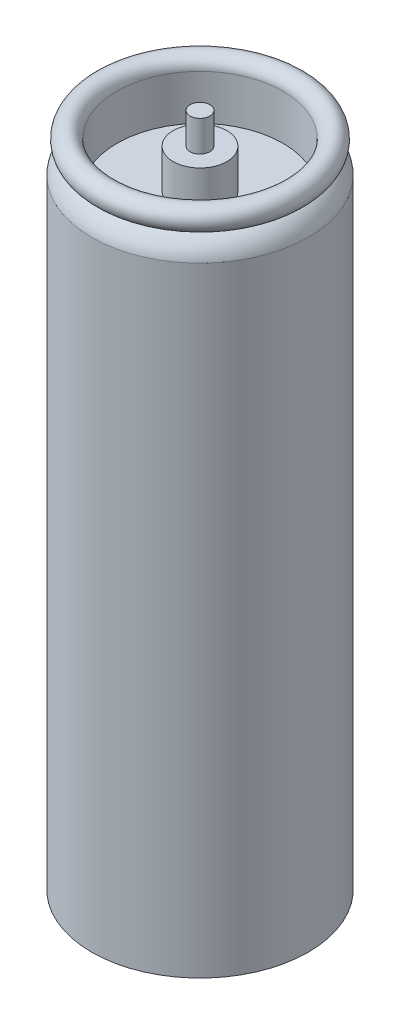
ISO-10303-21;
HEADER;
FILE_DESCRIPTION(('STEP AP214'),'2;1');
FILE_NAME('part.step','',(''),(''),'','','');
FILE_SCHEMA(('AUTOMOTIVE_DESIGN { 1 0 10303 214 1 1 1 1 }'));
ENDSEC;
DATA;
#1=APPLICATION_CONTEXT('core data for automotive mechanical design processes');
#2=APPLICATION_PROTOCOL_DEFINITION('international standard','automotive_design',2000,#1);
#3=PRODUCT_CONTEXT('',#1,'mechanical');
#4=PRODUCT('Part','Part','',(#3));
#5=PRODUCT_RELATED_PRODUCT_CATEGORY('part','',(#4));
#6=PRODUCT_DEFINITION_FORMATION('','',#4);
#7=PRODUCT_DEFINITION_CONTEXT('part definition',#1,'design');
#8=PRODUCT_DEFINITION('design','',#6,#7);
#9=PRODUCT_DEFINITION_SHAPE('','',#8);
#10=(LENGTH_UNIT() NAMED_UNIT(*) SI_UNIT(.MILLI.,.METRE.));
#11=(NAMED_UNIT(*) PLANE_ANGLE_UNIT() SI_UNIT($,.RADIAN.));
#12=(NAMED_UNIT(*) SI_UNIT($,.STERADIAN.) SOLID_ANGLE_UNIT());
#13=UNCERTAINTY_MEASURE_WITH_UNIT(LENGTH_MEASURE(1.E-05),#10,'distance_accuracy_value','');
#14=(GEOMETRIC_REPRESENTATION_CONTEXT(3) GLOBAL_UNCERTAINTY_ASSIGNED_CONTEXT((#13)) GLOBAL_UNIT_ASSIGNED_CONTEXT((#10,
#11,#12)) REPRESENTATION_CONTEXT('',''));
#15=CARTESIAN_POINT('',(0.,0.,0.));
#16=DIRECTION('',(0.,0.,1.));
#17=DIRECTION('',(1.,0.,0.));
#18=AXIS2_PLACEMENT_3D('',#15,#16,#17);
#19=CARTESIAN_POINT('',(0.,-1000.,0.));
#20=DIRECTION('',(0.,-1.,0.));
#21=DIRECTION('',(0.,0.,-1.));
#22=AXIS2_PLACEMENT_3D('',#19,#20,#21);
#23=CYLINDRICAL_SURFACE('',#22,17.5);
#24=CARTESIAN_POINT('',(0.,0.,0.));
#25=DIRECTION('',(0.,-1.,0.));
#26=DIRECTION('',(0.,0.,-1.));
#27=AXIS2_PLACEMENT_3D('',#24,#25,#26);
#28=CIRCLE('',#27,17.5);
#29=CARTESIAN_POINT('',(0.,0.,-17.5));
#30=VERTEX_POINT('',#29);
#31=EDGE_CURVE('E10',#30,#30,#28,.T.);
#32=ORIENTED_EDGE('',*,*,#31,.F.);
#33=EDGE_LOOP('',(#32));
#34=FACE_BOUND('',#33,.T.);
#35=CARTESIAN_POINT('',(0.,100.,0.));
#36=DIRECTION('',(0.,-1.,0.));
#37=DIRECTION('',(0.,0.,-1.));
#38=AXIS2_PLACEMENT_3D('',#35,#36,#37);
#39=CIRCLE('',#38,17.5);
#40=CARTESIAN_POINT('',(0.,100.,-17.5));
#41=VERTEX_POINT('',#40);
#42=EDGE_CURVE('E86',#41,#41,#39,.T.);
#43=ORIENTED_EDGE('',*,*,#42,.T.);
#44=EDGE_LOOP('',(#43));
#45=FACE_BOUND('',#44,.T.);
#46=ADVANCED_FACE('F43',(#34,#45),#23,.T.);
#47=CARTESIAN_POINT('',(-15.5,0.,0.));
#48=DIRECTION('',(0.,1.,0.));
#49=DIRECTION('',(0.,0.,1.));
#50=AXIS2_PLACEMENT_3D('',#47,#48,#49);
#51=PLANE('',#50);
#52=CARTESIAN_POINT('',(0.,0.,0.));
#53=DIRECTION('',(0.,-1.,0.));
#54=DIRECTION('',(0.,0.,-1.));
#55=AXIS2_PLACEMENT_3D('',#52,#53,#54);
#56=CIRCLE('',#55,15.5);
#57=CARTESIAN_POINT('',(0.,0.,-15.5));
#58=VERTEX_POINT('',#57);
#59=EDGE_CURVE('E50',#58,#58,#56,.T.);
#60=ORIENTED_EDGE('',*,*,#59,.F.);
#61=EDGE_LOOP('',(#60));
#62=FACE_BOUND('',#61,.T.);
#63=ORIENTED_EDGE('',*,*,#31,.T.);
#64=EDGE_LOOP('',(#63));
#65=FACE_BOUND('',#64,.T.);
#66=ADVANCED_FACE('F141',(#62,#65),#51,.F.);
#67=CARTESIAN_POINT('',(0.,-42.2463016132773,0.));
#68=DIRECTION('',(0.,-1.,0.));
#69=DIRECTION('',(-1.,0.,0.));
#70=AXIS2_PLACEMENT_3D('',#67,#68,#69);
#71=SPHERICAL_SURFACE('',#70,45.);
#72=ORIENTED_EDGE('',*,*,#59,.T.);
#73=EDGE_LOOP('',(#72));
#74=FACE_BOUND('',#73,.T.);
#75=ADVANCED_FACE('F136',(#74),#71,.F.);
#76=CARTESIAN_POINT('',(0.,108.999749207588,0.));
#77=DIRECTION('',(0.,-1.,0.));
#78=DIRECTION('',(0.,0.,-1.));
#79=AXIS2_PLACEMENT_3D('',#76,#77,#78);
#80=PLANE('',#79);
#81=CARTESIAN_POINT('',(0.,108.999749207588,0.));
#82=DIRECTION('',(0.,-1.,0.));
#83=DIRECTION('',(0.,0.,-1.));
#84=AXIS2_PLACEMENT_3D('',#81,#82,#83);
#85=CIRCLE('',#84,1.5875);
#86=CARTESIAN_POINT('',(0.,108.999749207588,-1.5875));
#87=VERTEX_POINT('',#86);
#88=EDGE_CURVE('E55',#87,#87,#85,.T.);
#89=ORIENTED_EDGE('',*,*,#88,.F.);
#90=EDGE_LOOP('',(#89));
#91=FACE_BOUND('',#90,.T.);
#92=ADVANCED_FACE('F131',(#91),#80,.F.);
#93=CARTESIAN_POINT('',(0.,-1000.,0.));
#94=DIRECTION('',(0.,-1.,0.));
#95=DIRECTION('',(0.,0.,-1.));
#96=AXIS2_PLACEMENT_3D('',#93,#94,#95);
#97=CYLINDRICAL_SURFACE('',#96,1.5875);
#98=CARTESIAN_POINT('',(0.,103.999749207587,0.));
#99=DIRECTION('',(0.,-1.,0.));
#100=DIRECTION('',(0.,0.,-1.));
#101=AXIS2_PLACEMENT_3D('',#98,#99,#100);
#102=CIRCLE('',#101,1.5875);
#103=CARTESIAN_POINT('',(0.,103.999749207587,-1.5875));
#104=VERTEX_POINT('',#103);
#105=EDGE_CURVE('E60',#104,#104,#102,.T.);
#106=ORIENTED_EDGE('',*,*,#105,.F.);
#107=EDGE_LOOP('',(#106));
#108=FACE_BOUND('',#107,.T.);
#109=ORIENTED_EDGE('',*,*,#88,.T.);
#110=EDGE_LOOP('',(#109));
#111=FACE_BOUND('',#110,.T.);
#112=ADVANCED_FACE('F125',(#108,#111),#97,.T.);
#113=CARTESIAN_POINT('',(-1.5875,103.999749207588,0.));
#114=DIRECTION('',(0.,-1.,0.));
#115=DIRECTION('',(0.,0.,-1.));
#116=AXIS2_PLACEMENT_3D('',#113,#114,#115);
#117=PLANE('',#116);
#118=CARTESIAN_POINT('',(0.,103.999749207587,0.));
#119=DIRECTION('',(0.,-1.,0.));
#120=DIRECTION('',(0.,0.,-1.));
#121=AXIS2_PLACEMENT_3D('',#118,#119,#120);
#122=CIRCLE('',#121,4.33325557762809);
#123=CARTESIAN_POINT('',(0.,103.999749207587,-4.33325557762809));
#124=VERTEX_POINT('',#123);
#125=EDGE_CURVE('E66',#124,#124,#122,.T.);
#126=ORIENTED_EDGE('',*,*,#125,.F.);
#127=EDGE_LOOP('',(#126));
#128=FACE_BOUND('',#127,.T.);
#129=ORIENTED_EDGE('',*,*,#105,.T.);
#130=EDGE_LOOP('',(#129));
#131=FACE_BOUND('',#130,.T.);
#132=ADVANCED_FACE('F119',(#128,#131),#117,.F.);
#133=CARTESIAN_POINT('',(0.,-1000.,0.));
#134=DIRECTION('',(0.,-1.,0.));
#135=DIRECTION('',(0.,0.,-1.));
#136=AXIS2_PLACEMENT_3D('',#133,#134,#135);
#137=CYLINDRICAL_SURFACE('',#136,4.33325557762809);
#138=CARTESIAN_POINT('',(0.,97.6923541355723,0.));
#139=DIRECTION('',(0.,-1.,0.));
#140=DIRECTION('',(0.,0.,-1.));
#141=AXIS2_PLACEMENT_3D('',#138,#139,#140);
#142=CIRCLE('',#141,4.33325557762809);
#143=CARTESIAN_POINT('',(0.,97.6923541355723,-4.33325557762809));
#144=VERTEX_POINT('',#143);
#145=EDGE_CURVE('E70',#144,#144,#142,.T.);
#146=ORIENTED_EDGE('',*,*,#145,.F.);
#147=EDGE_LOOP('',(#146));
#148=FACE_BOUND('',#147,.T.);
#149=ORIENTED_EDGE('',*,*,#125,.T.);
#150=EDGE_LOOP('',(#149));
#151=FACE_BOUND('',#150,.T.);
#152=ADVANCED_FACE('F113',(#148,#151),#137,.T.);
#153=CARTESIAN_POINT('',(-4.33325557762809,97.6923541355724,0.));
#154=DIRECTION('',(0.,-1.,0.));
#155=DIRECTION('',(0.,0.,-1.));
#156=AXIS2_PLACEMENT_3D('',#153,#154,#155);
#157=PLANE('',#156);
#158=CARTESIAN_POINT('',(0.,97.6923541355723,0.));
#159=DIRECTION('',(0.,-1.,0.));
#160=DIRECTION('',(0.,0.,-1.));
#161=AXIS2_PLACEMENT_3D('',#158,#159,#160);
#162=CIRCLE('',#161,13.4028420774815);
#163=CARTESIAN_POINT('',(0.,97.6923541355723,-13.4028420774815));
#164=VERTEX_POINT('',#163);
#165=EDGE_CURVE('E74',#164,#164,#162,.T.);
#166=ORIENTED_EDGE('',*,*,#165,.F.);
#167=EDGE_LOOP('',(#166));
#168=FACE_BOUND('',#167,.T.);
#169=ORIENTED_EDGE('',*,*,#145,.T.);
#170=EDGE_LOOP('',(#169));
#171=FACE_BOUND('',#170,.T.);
#172=ADVANCED_FACE('F107',(#168,#171),#157,.F.);
#173=CARTESIAN_POINT('',(0.,-1000.,0.));
#174=DIRECTION('',(0.,-1.,0.));
#175=DIRECTION('',(0.,0.,-1.));
#176=AXIS2_PLACEMENT_3D('',#173,#174,#175);
#177=CYLINDRICAL_SURFACE('',#176,13.4028420774815);
#178=CARTESIAN_POINT('',(0.,104.983380512879,0.));
#179=DIRECTION('',(0.,-1.,0.));
#180=DIRECTION('',(0.,0.,-1.));
#181=AXIS2_PLACEMENT_3D('',#178,#179,#180);
#182=CIRCLE('',#181,13.4028420774815);
#183=CARTESIAN_POINT('',(0.,104.983380512879,-13.4028420774815));
#184=VERTEX_POINT('',#183);
#185=EDGE_CURVE('E78',#184,#184,#182,.T.);
#186=ORIENTED_EDGE('',*,*,#185,.F.);
#187=EDGE_LOOP('',(#186));
#188=FACE_BOUND('',#187,.T.);
#189=ORIENTED_EDGE('',*,*,#165,.T.);
#190=EDGE_LOOP('',(#189));
#191=FACE_BOUND('',#190,.T.);
#192=ADVANCED_FACE('F101',(#188,#191),#177,.F.);
#193=CARTESIAN_POINT('',(0.,104.983380512878,0.));
#194=DIRECTION('',(0.,-1.,0.));
#195=DIRECTION('',(0.,0.,-1.));
#196=AXIS2_PLACEMENT_3D('',#193,#194,#195);
#197=TOROIDAL_SURFACE('',#196,15.2367243273833,1.83388224990178);
#198=CARTESIAN_POINT('',(0.,103.237425306392,0.));
#199=DIRECTION('',(0.,-1.,0.));
#200=DIRECTION('',(0.,0.,-1.));
#201=AXIS2_PLACEMENT_3D('',#198,#199,#200);
#202=CIRCLE('',#201,14.6756855377734);
#203=CARTESIAN_POINT('',(0.,103.237425306392,-14.6756855377734));
#204=VERTEX_POINT('',#203);
#205=EDGE_CURVE('E82',#204,#204,#202,.T.);
#206=ORIENTED_EDGE('',*,*,#205,.F.);
#207=EDGE_LOOP('',(#206));
#208=FACE_BOUND('',#207,.T.);
#209=ORIENTED_EDGE('',*,*,#185,.T.);
#210=EDGE_LOOP('',(#209));
#211=FACE_BOUND('',#210,.T.);
#212=ADVANCED_FACE('F95',(#208,#211),#197,.T.);
#213=CARTESIAN_POINT('',(0.,99.2763308015275,0.));
#214=DIRECTION('',(0.,-1.,0.));
#215=DIRECTION('',(0.,0.,-1.));
#216=AXIS2_PLACEMENT_3D('',#213,#214,#215);
#217=TOROIDAL_SURFACE('',#216,13.4028420774815,4.16057690120901);
#218=ORIENTED_EDGE('',*,*,#42,.F.);
#219=EDGE_LOOP('',(#218));
#220=FACE_BOUND('',#219,.T.);
#221=ORIENTED_EDGE('',*,*,#205,.T.);
#222=EDGE_LOOP('',(#221));
#223=FACE_BOUND('',#222,.T.);
#224=ADVANCED_FACE('F92',(#220,#223),#217,.T.);
#225=CLOSED_SHELL('',(#46,#66,#75,#92,#112,#132,#152,#172,#192,#212,#224));
#226=MANIFOLD_SOLID_BREP('B2',#225);
#227=ADVANCED_BREP_SHAPE_REPRESENTATION('',(#18,#226),#14);
#228=SHAPE_DEFINITION_REPRESENTATION(#9,#227);
ENDSEC;
END-ISO-10303-21;
